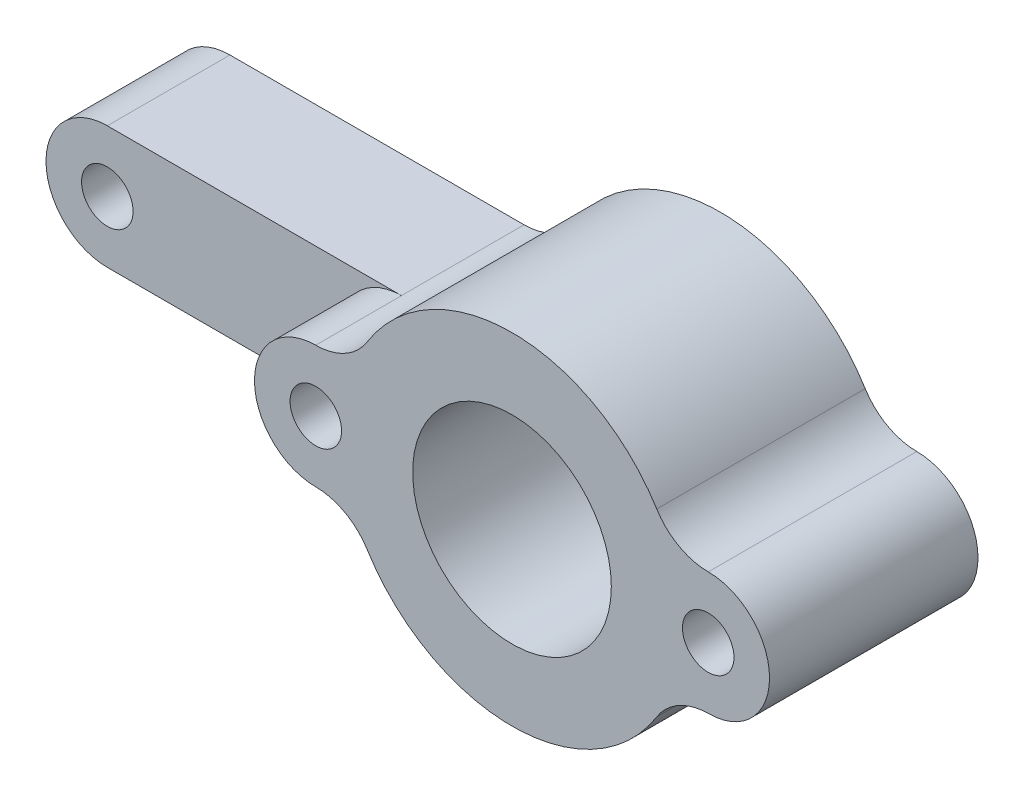
ISO-10303-21;
HEADER;
FILE_DESCRIPTION(('STEP AP214'),'2;1');
FILE_NAME('part.step','',(''),(''),'','','');
FILE_SCHEMA(('AUTOMOTIVE_DESIGN { 1 0 10303 214 1 1 1 1 }'));
ENDSEC;
DATA;
#1=APPLICATION_CONTEXT('core data for automotive mechanical design processes');
#2=APPLICATION_PROTOCOL_DEFINITION('international standard','automotive_design',2000,#1);
#3=PRODUCT_CONTEXT('',#1,'mechanical');
#4=PRODUCT('Part','Part','',(#3));
#5=PRODUCT_RELATED_PRODUCT_CATEGORY('part','',(#4));
#6=PRODUCT_DEFINITION_FORMATION('','',#4);
#7=PRODUCT_DEFINITION_CONTEXT('part definition',#1,'design');
#8=PRODUCT_DEFINITION('design','',#6,#7);
#9=PRODUCT_DEFINITION_SHAPE('','',#8);
#10=(LENGTH_UNIT() NAMED_UNIT(*) SI_UNIT(.MILLI.,.METRE.));
#11=(NAMED_UNIT(*) PLANE_ANGLE_UNIT() SI_UNIT($,.RADIAN.));
#12=(NAMED_UNIT(*) SI_UNIT($,.STERADIAN.) SOLID_ANGLE_UNIT());
#13=UNCERTAINTY_MEASURE_WITH_UNIT(LENGTH_MEASURE(1.E-05),#10,'distance_accuracy_value','');
#14=(GEOMETRIC_REPRESENTATION_CONTEXT(3) GLOBAL_UNCERTAINTY_ASSIGNED_CONTEXT((#13)) GLOBAL_UNIT_ASSIGNED_CONTEXT((#10,
#11,#12)) REPRESENTATION_CONTEXT('',''));
#15=CARTESIAN_POINT('',(0.,0.,0.));
#16=DIRECTION('',(0.,0.,1.));
#17=DIRECTION('',(1.,0.,0.));
#18=AXIS2_PLACEMENT_3D('',#15,#16,#17);
#19=CARTESIAN_POINT('',(-20.,0.,5.));
#20=DIRECTION('',(0.,0.,1.));
#21=DIRECTION('',(1.,0.,0.));
#22=AXIS2_PLACEMENT_3D('',#19,#20,#21);
#23=PLANE('',#22);
#24=CARTESIAN_POINT('',(-20.,0.,5.));
#25=DIRECTION('',(0.,0.,1.));
#26=DIRECTION('',(1.,0.,0.));
#27=AXIS2_PLACEMENT_3D('',#24,#25,#26);
#28=CIRCLE('',#27,1.05);
#29=CARTESIAN_POINT('',(-18.95,0.,5.));
#30=VERTEX_POINT('',#29);
#31=EDGE_CURVE('E295',#30,#30,#28,.T.);
#32=ORIENTED_EDGE('',*,*,#31,.F.);
#33=EDGE_LOOP('',(#32));
#34=FACE_BOUND('',#33,.T.);
#35=DIRECTION('',(1.,0.,0.));
#36=VECTOR('',#35,1.);
#37=CARTESIAN_POINT('',(-20.,-2.5,5.));
#38=LINE('',#37,#36);
#39=CARTESIAN_POINT('',(-20.,-2.5,5.));
#40=VERTEX_POINT('',#39);
#41=CARTESIAN_POINT('',(-8.01888369289576,-2.49996434112291,5.));
#42=VERTEX_POINT('',#41);
#43=EDGE_CURVE('E266',#40,#42,#38,.T.);
#44=ORIENTED_EDGE('',*,*,#43,.T.);
#45=CARTESIAN_POINT('',(-8.,0.,5.));
#46=DIRECTION('',(0.,0.,1.));
#47=DIRECTION('',(1.,0.,0.));
#48=AXIS2_PLACEMENT_3D('',#45,#46,#47);
#49=CIRCLE('',#48,2.5);
#50=CARTESIAN_POINT('',(-8.00390434736488,2.49999695121247,5.));
#51=VERTEX_POINT('',#50);
#52=EDGE_CURVE('E258',#42,#51,#49,.F.);
#53=ORIENTED_EDGE('',*,*,#52,.T.);
#54=CARTESIAN_POINT('',(-8.00777746943557,4.98,5.));
#55=DIRECTION('',(0.,0.,1.));
#56=DIRECTION('',(1.,0.,0.));
#57=AXIS2_PLACEMENT_3D('',#54,#55,#56);
#58=CIRCLE('',#57,2.48);
#59=CARTESIAN_POINT('',(-8.00777746943557,2.5,5.));
#60=VERTEX_POINT('',#59);
#61=EDGE_CURVE('E11',#51,#60,#58,.F.);
#62=ORIENTED_EDGE('',*,*,#61,.T.);
#63=DIRECTION('',(-1.,0.,0.));
#64=VECTOR('',#63,1.);
#65=CARTESIAN_POINT('',(-8.,2.5,5.));
#66=LINE('',#65,#64);
#67=CARTESIAN_POINT('',(-20.,2.5,5.));
#68=VERTEX_POINT('',#67);
#69=EDGE_CURVE('E256',#60,#68,#66,.T.);
#70=ORIENTED_EDGE('',*,*,#69,.T.);
#71=CARTESIAN_POINT('',(-20.,0.,5.));
#72=DIRECTION('',(0.,0.,1.));
#73=DIRECTION('',(1.,0.,0.));
#74=AXIS2_PLACEMENT_3D('',#71,#72,#73);
#75=CIRCLE('',#74,2.5);
#76=EDGE_CURVE('E264',#68,#40,#75,.T.);
#77=ORIENTED_EDGE('',*,*,#76,.T.);
#78=EDGE_LOOP('',(#44,#53,#62,#70,#77));
#79=FACE_BOUND('',#78,.T.);
#80=ADVANCED_FACE('F43',(#34,#79),#23,.T.);
#81=CARTESIAN_POINT('',(-20.,0.,0.));
#82=DIRECTION('',(0.,0.,1.));
#83=DIRECTION('',(1.,0.,0.));
#84=AXIS2_PLACEMENT_3D('',#81,#82,#83);
#85=PLANE('',#84);
#86=CARTESIAN_POINT('',(8.,0.,0.));
#87=DIRECTION('',(0.,0.,1.));
#88=DIRECTION('',(1.,0.,0.));
#89=AXIS2_PLACEMENT_3D('',#86,#87,#88);
#90=CIRCLE('',#89,2.05);
#91=CARTESIAN_POINT('',(10.05,0.,0.));
#92=VERTEX_POINT('',#91);
#93=EDGE_CURVE('E362',#92,#92,#90,.T.);
#94=ORIENTED_EDGE('',*,*,#93,.T.);
#95=EDGE_LOOP('',(#94));
#96=FACE_BOUND('',#95,.T.);
#97=CARTESIAN_POINT('',(-8.,0.,0.));
#98=DIRECTION('',(0.,0.,1.));
#99=DIRECTION('',(1.,0.,0.));
#100=AXIS2_PLACEMENT_3D('',#97,#98,#99);
#101=CIRCLE('',#100,2.05);
#102=CARTESIAN_POINT('',(-5.95,0.,0.));
#103=VERTEX_POINT('',#102);
#104=EDGE_CURVE('E363',#103,#103,#101,.T.);
#105=ORIENTED_EDGE('',*,*,#104,.T.);
#106=EDGE_LOOP('',(#105));
#107=FACE_BOUND('',#106,.T.);
#108=CARTESIAN_POINT('',(-20.,0.,0.));
#109=DIRECTION('',(0.,0.,1.));
#110=DIRECTION('',(1.,0.,0.));
#111=AXIS2_PLACEMENT_3D('',#108,#109,#110);
#112=CIRCLE('',#111,2.5);
#113=CARTESIAN_POINT('',(-20.,2.5,0.));
#114=VERTEX_POINT('',#113);
#115=CARTESIAN_POINT('',(-20.,-2.5,0.));
#116=VERTEX_POINT('',#115);
#117=EDGE_CURVE('E275',#114,#116,#112,.T.);
#118=ORIENTED_EDGE('',*,*,#117,.F.);
#119=DIRECTION('',(-1.,0.,0.));
#120=VECTOR('',#119,1.);
#121=CARTESIAN_POINT('',(-8.,2.5,0.));
#122=LINE('',#121,#120);
#123=CARTESIAN_POINT('',(-8.00777746943557,2.5,0.));
#124=VERTEX_POINT('',#123);
#125=EDGE_CURVE('E242',#124,#114,#122,.T.);
#126=ORIENTED_EDGE('',*,*,#125,.F.);
#127=CARTESIAN_POINT('',(-8.00777746943557,4.98,0.));
#128=DIRECTION('',(0.,0.,1.));
#129=DIRECTION('',(1.,0.,0.));
#130=AXIS2_PLACEMENT_3D('',#127,#128,#129);
#131=CIRCLE('',#130,2.48);
#132=CARTESIAN_POINT('',(-5.90180842127012,3.67030752916225,0.));
#133=VERTEX_POINT('',#132);
#134=EDGE_CURVE('E233',#124,#133,#131,.T.);
#135=ORIENTED_EDGE('',*,*,#134,.T.);
#136=CARTESIAN_POINT('',(0.,0.,0.));
#137=DIRECTION('',(0.,0.,1.));
#138=DIRECTION('',(1.,0.,0.));
#139=AXIS2_PLACEMENT_3D('',#136,#137,#138);
#140=CIRCLE('',#139,6.95);
#141=CARTESIAN_POINT('',(5.90181120758219,3.67030304880364,0.));
#142=VERTEX_POINT('',#141);
#143=EDGE_CURVE('E241',#142,#133,#140,.T.);
#144=ORIENTED_EDGE('',*,*,#143,.F.);
#145=CARTESIAN_POINT('',(8.00778125,4.97999392089473,0.));
#146=DIRECTION('',(0.,0.,1.));
#147=DIRECTION('',(1.,0.,0.));
#148=AXIS2_PLACEMENT_3D('',#145,#146,#147);
#149=CIRCLE('',#148,2.48);
#150=CARTESIAN_POINT('',(8.00390625,2.49999694824033,0.));
#151=VERTEX_POINT('',#150);
#152=EDGE_CURVE('E229',#142,#151,#149,.T.);
#153=ORIENTED_EDGE('',*,*,#152,.T.);
#154=CARTESIAN_POINT('',(8.,0.,0.));
#155=DIRECTION('',(0.,0.,1.));
#156=DIRECTION('',(1.,0.,0.));
#157=AXIS2_PLACEMENT_3D('',#154,#155,#156);
#158=CIRCLE('',#157,2.5);
#159=CARTESIAN_POINT('',(8.009453125,-2.49998212762166,0.));
#160=VERTEX_POINT('',#159);
#161=EDGE_CURVE('E250',#160,#151,#158,.T.);
#162=ORIENTED_EDGE('',*,*,#161,.F.);
#163=CARTESIAN_POINT('',(8.01890625,-4.99996425524333,0.));
#164=DIRECTION('',(0.,0.,1.));
#165=DIRECTION('',(1.,0.,0.));
#166=AXIS2_PLACEMENT_3D('',#163,#164,#165);
#167=CIRCLE('',#166,2.5);
#168=CARTESIAN_POINT('',(5.89750248015873,-3.67722238877684,0.));
#169=VERTEX_POINT('',#168);
#170=EDGE_CURVE('E156',#160,#169,#167,.T.);
#171=ORIENTED_EDGE('',*,*,#170,.T.);
#172=CARTESIAN_POINT('',(0.,0.,0.));
#173=DIRECTION('',(0.,0.,1.));
#174=DIRECTION('',(1.,0.,0.));
#175=AXIS2_PLACEMENT_3D('',#172,#173,#174);
#176=CIRCLE('',#175,6.95);
#177=CARTESIAN_POINT('',(-5.8974860886375,-3.67724867724868,0.));
#178=VERTEX_POINT('',#177);
#179=EDGE_CURVE('E376',#178,#169,#176,.T.);
#180=ORIENTED_EDGE('',*,*,#179,.F.);
#181=CARTESIAN_POINT('',(-8.01888396224811,-5.,0.));
#182=DIRECTION('',(0.,0.,1.));
#183=DIRECTION('',(1.,0.,0.));
#184=AXIS2_PLACEMENT_3D('',#181,#182,#183);
#185=CIRCLE('',#184,2.5);
#186=CARTESIAN_POINT('',(-8.01888396224811,-2.5,0.));
#187=VERTEX_POINT('',#186);
#188=EDGE_CURVE('E157',#178,#187,#185,.T.);
#189=ORIENTED_EDGE('',*,*,#188,.T.);
#190=DIRECTION('',(1.,0.,0.));
#191=VECTOR('',#190,1.);
#192=CARTESIAN_POINT('',(-8.,-2.5,0.));
#193=LINE('',#192,#191);
#194=EDGE_CURVE('E300',#116,#187,#193,.T.);
#195=ORIENTED_EDGE('',*,*,#194,.F.);
#196=EDGE_LOOP('',(#118,#126,#135,#144,#153,#162,#171,#180,#189,#195));
#197=FACE_BOUND('',#196,.T.);
#198=CARTESIAN_POINT('',(-20.,0.,0.));
#199=DIRECTION('',(0.,0.,1.));
#200=DIRECTION('',(1.,0.,0.));
#201=AXIS2_PLACEMENT_3D('',#198,#199,#200);
#202=CIRCLE('',#201,1.05);
#203=CARTESIAN_POINT('',(-18.95,0.,0.));
#204=VERTEX_POINT('',#203);
#205=EDGE_CURVE('E270',#204,#204,#202,.T.);
#206=ORIENTED_EDGE('',*,*,#205,.T.);
#207=EDGE_LOOP('',(#206));
#208=FACE_BOUND('',#207,.T.);
#209=CARTESIAN_POINT('',(0.,0.,0.));
#210=DIRECTION('',(0.,0.,1.));
#211=DIRECTION('',(1.,0.,0.));
#212=AXIS2_PLACEMENT_3D('',#209,#210,#211);
#213=CIRCLE('',#212,4.05);
#214=CARTESIAN_POINT('',(4.05,0.,0.));
#215=VERTEX_POINT('',#214);
#216=EDGE_CURVE('E140',#215,#215,#213,.T.);
#217=ORIENTED_EDGE('',*,*,#216,.T.);
#218=EDGE_LOOP('',(#217));
#219=FACE_BOUND('',#218,.T.);
#220=ADVANCED_FACE('F239',(#96,#107,#197,#208,#219),#85,.F.);
#221=CARTESIAN_POINT('',(-20.,0.,5.));
#222=DIRECTION('',(0.,0.,-1.));
#223=DIRECTION('',(-1.,0.,0.));
#224=AXIS2_PLACEMENT_3D('',#221,#222,#223);
#225=CYLINDRICAL_SURFACE('',#224,2.5);
#226=ORIENTED_EDGE('',*,*,#117,.T.);
#227=DIRECTION('',(0.,0.,-1.));
#228=VECTOR('',#227,1.);
#229=CARTESIAN_POINT('',(-20.,-2.5,5.));
#230=LINE('',#229,#228);
#231=EDGE_CURVE('E279',#40,#116,#230,.T.);
#232=ORIENTED_EDGE('',*,*,#231,.F.);
#233=ORIENTED_EDGE('',*,*,#76,.F.);
#234=DIRECTION('',(0.,0.,-1.));
#235=VECTOR('',#234,1.);
#236=CARTESIAN_POINT('',(-20.,2.5,5.));
#237=LINE('',#236,#235);
#238=EDGE_CURVE('E263',#68,#114,#237,.T.);
#239=ORIENTED_EDGE('',*,*,#238,.T.);
#240=EDGE_LOOP('',(#226,#232,#233,#239));
#241=FACE_BOUND('',#240,.T.);
#242=ADVANCED_FACE('F322',(#241),#225,.T.);
#243=CARTESIAN_POINT('',(-8.,-2.5,5.));
#244=DIRECTION('',(0.,1.,0.));
#245=DIRECTION('',(0.,0.,1.));
#246=AXIS2_PLACEMENT_3D('',#243,#244,#245);
#247=PLANE('',#246);
#248=ORIENTED_EDGE('',*,*,#194,.T.);
#249=DIRECTION('',(0.,0.,1.));
#250=VECTOR('',#249,1.);
#251=CARTESIAN_POINT('',(-8.01888396224811,-2.5,8.5));
#252=LINE('',#251,#250);
#253=EDGE_CURVE('E282',#187,#42,#252,.T.);
#254=ORIENTED_EDGE('',*,*,#253,.T.);
#255=ORIENTED_EDGE('',*,*,#43,.F.);
#256=ORIENTED_EDGE('',*,*,#231,.T.);
#257=EDGE_LOOP('',(#248,#254,#255,#256));
#258=FACE_BOUND('',#257,.T.);
#259=ADVANCED_FACE('F338',(#258),#247,.F.);
#260=CARTESIAN_POINT('',(0.,0.,5.));
#261=DIRECTION('',(0.,0.,-1.));
#262=DIRECTION('',(-1.,0.,0.));
#263=AXIS2_PLACEMENT_3D('',#260,#261,#262);
#264=CYLINDRICAL_SURFACE('',#263,6.95);
#265=CARTESIAN_POINT('',(0.,0.,8.5));
#266=DIRECTION('',(0.,0.,1.));
#267=DIRECTION('',(1.,0.,0.));
#268=AXIS2_PLACEMENT_3D('',#265,#266,#267);
#269=CIRCLE('',#268,6.95);
#270=CARTESIAN_POINT('',(-5.8974860886375,-3.67724867724868,8.5));
#271=VERTEX_POINT('',#270);
#272=CARTESIAN_POINT('',(5.89750248015873,-3.67722238877684,8.5));
#273=VERTEX_POINT('',#272);
#274=EDGE_CURVE('E377',#271,#273,#269,.T.);
#275=ORIENTED_EDGE('',*,*,#274,.F.);
#276=DIRECTION('',(0.,0.,-1.));
#277=VECTOR('',#276,1.);
#278=CARTESIAN_POINT('',(-5.8974860886375,-3.67724867724868,5.));
#279=LINE('',#278,#277);
#280=EDGE_CURVE('E155',#271,#178,#279,.T.);
#281=ORIENTED_EDGE('',*,*,#280,.T.);
#282=ORIENTED_EDGE('',*,*,#179,.T.);
#283=DIRECTION('',(0.,0.,-1.));
#284=VECTOR('',#283,1.);
#285=CARTESIAN_POINT('',(5.89750248015873,-3.67722238877684,5.));
#286=LINE('',#285,#284);
#287=EDGE_CURVE('E372',#169,#273,#286,.F.);
#288=ORIENTED_EDGE('',*,*,#287,.T.);
#289=EDGE_LOOP('',(#275,#281,#282,#288));
#290=FACE_BOUND('',#289,.T.);
#291=ADVANCED_FACE('F334',(#290),#264,.T.);
#292=CARTESIAN_POINT('',(8.,0.,5.));
#293=DIRECTION('',(0.,0.,-1.));
#294=DIRECTION('',(-1.,0.,0.));
#295=AXIS2_PLACEMENT_3D('',#292,#293,#294);
#296=CYLINDRICAL_SURFACE('',#295,2.5);
#297=ORIENTED_EDGE('',*,*,#161,.T.);
#298=DIRECTION('',(0.,0.,-1.));
#299=VECTOR('',#298,1.);
#300=CARTESIAN_POINT('',(8.00390625,2.49999694824033,5.));
#301=LINE('',#300,#299);
#302=CARTESIAN_POINT('',(8.00390625,2.49999694824033,8.5));
#303=VERTEX_POINT('',#302);
#304=EDGE_CURVE('E223',#151,#303,#301,.F.);
#305=ORIENTED_EDGE('',*,*,#304,.T.);
#306=CARTESIAN_POINT('',(8.,0.,8.5));
#307=DIRECTION('',(0.,0.,1.));
#308=DIRECTION('',(1.,0.,0.));
#309=AXIS2_PLACEMENT_3D('',#306,#307,#308);
#310=CIRCLE('',#309,2.5);
#311=CARTESIAN_POINT('',(8.009453125,-2.49998212762166,8.5));
#312=VERTEX_POINT('',#311);
#313=EDGE_CURVE('E388',#312,#303,#310,.T.);
#314=ORIENTED_EDGE('',*,*,#313,.F.);
#315=DIRECTION('',(0.,0.,-1.));
#316=VECTOR('',#315,1.);
#317=CARTESIAN_POINT('',(8.009453125,-2.49998212762166,5.));
#318=LINE('',#317,#316);
#319=EDGE_CURVE('E161',#312,#160,#318,.T.);
#320=ORIENTED_EDGE('',*,*,#319,.T.);
#321=EDGE_LOOP('',(#297,#305,#314,#320));
#322=FACE_BOUND('',#321,.T.);
#323=ADVANCED_FACE('F331',(#322),#296,.T.);
#324=CARTESIAN_POINT('',(0.,0.,5.));
#325=DIRECTION('',(0.,0.,-1.));
#326=DIRECTION('',(-1.,0.,0.));
#327=AXIS2_PLACEMENT_3D('',#324,#325,#326);
#328=CYLINDRICAL_SURFACE('',#327,6.95);
#329=CARTESIAN_POINT('',(0.,0.,8.5));
#330=DIRECTION('',(0.,0.,1.));
#331=DIRECTION('',(1.,0.,0.));
#332=AXIS2_PLACEMENT_3D('',#329,#330,#331);
#333=CIRCLE('',#332,6.95);
#334=CARTESIAN_POINT('',(5.90181120758219,3.67030304880364,8.5));
#335=VERTEX_POINT('',#334);
#336=CARTESIAN_POINT('',(-5.90180842127012,3.67030752916225,8.5));
#337=VERTEX_POINT('',#336);
#338=EDGE_CURVE('E150',#335,#337,#333,.T.);
#339=ORIENTED_EDGE('',*,*,#338,.F.);
#340=DIRECTION('',(0.,0.,-1.));
#341=VECTOR('',#340,1.);
#342=CARTESIAN_POINT('',(5.90181120758219,3.67030304880364,5.));
#343=LINE('',#342,#341);
#344=EDGE_CURVE('E220',#335,#142,#343,.T.);
#345=ORIENTED_EDGE('',*,*,#344,.T.);
#346=ORIENTED_EDGE('',*,*,#143,.T.);
#347=DIRECTION('',(0.,0.,-1.));
#348=VECTOR('',#347,1.);
#349=CARTESIAN_POINT('',(-5.90180842127012,3.67030752916225,5.));
#350=LINE('',#349,#348);
#351=EDGE_CURVE('E213',#133,#337,#350,.F.);
#352=ORIENTED_EDGE('',*,*,#351,.T.);
#353=EDGE_LOOP('',(#339,#345,#346,#352));
#354=FACE_BOUND('',#353,.T.);
#355=ADVANCED_FACE('F248',(#354),#328,.T.);
#356=CARTESIAN_POINT('',(-8.,2.5,5.));
#357=DIRECTION('',(0.,-1.,0.));
#358=DIRECTION('',(0.,0.,-1.));
#359=AXIS2_PLACEMENT_3D('',#356,#357,#358);
#360=PLANE('',#359);
#361=ORIENTED_EDGE('',*,*,#69,.F.);
#362=DIRECTION('',(0.,0.,1.));
#363=VECTOR('',#362,1.);
#364=CARTESIAN_POINT('',(-8.00777746943557,2.5,0.));
#365=LINE('',#364,#363);
#366=EDGE_CURVE('E225',#60,#124,#365,.F.);
#367=ORIENTED_EDGE('',*,*,#366,.T.);
#368=ORIENTED_EDGE('',*,*,#125,.T.);
#369=ORIENTED_EDGE('',*,*,#238,.F.);
#370=EDGE_LOOP('',(#361,#367,#368,#369));
#371=FACE_BOUND('',#370,.T.);
#372=ADVANCED_FACE('F261',(#371),#360,.F.);
#373=CARTESIAN_POINT('',(-8.,0.,5.));
#374=DIRECTION('',(0.,0.,-1.));
#375=DIRECTION('',(-1.,0.,0.));
#376=AXIS2_PLACEMENT_3D('',#373,#374,#375);
#377=CYLINDRICAL_SURFACE('',#376,1.05);
#378=CARTESIAN_POINT('',(-8.,0.,1.));
#379=DIRECTION('',(0.,0.,1.));
#380=DIRECTION('',(1.,0.,0.));
#381=AXIS2_PLACEMENT_3D('',#378,#379,#380);
#382=CIRCLE('',#381,1.05);
#383=CARTESIAN_POINT('',(-6.95,0.,1.));
#384=VERTEX_POINT('',#383);
#385=EDGE_CURVE('E365',#384,#384,#382,.F.);
#386=ORIENTED_EDGE('',*,*,#385,.T.);
#387=EDGE_LOOP('',(#386));
#388=FACE_BOUND('',#387,.T.);
#389=CARTESIAN_POINT('',(-8.,0.,8.5));
#390=DIRECTION('',(0.,0.,1.));
#391=DIRECTION('',(1.,0.,0.));
#392=AXIS2_PLACEMENT_3D('',#389,#390,#391);
#393=CIRCLE('',#392,1.05);
#394=CARTESIAN_POINT('',(-6.95,0.,8.5));
#395=VERTEX_POINT('',#394);
#396=EDGE_CURVE('E396',#395,#395,#393,.F.);
#397=ORIENTED_EDGE('',*,*,#396,.F.);
#398=EDGE_LOOP('',(#397));
#399=FACE_BOUND('',#398,.T.);
#400=ADVANCED_FACE('F313',(#388,#399),#377,.F.);
#401=CARTESIAN_POINT('',(8.,0.,5.));
#402=DIRECTION('',(0.,0.,-1.));
#403=DIRECTION('',(-1.,0.,0.));
#404=AXIS2_PLACEMENT_3D('',#401,#402,#403);
#405=CYLINDRICAL_SURFACE('',#404,1.05);
#406=CARTESIAN_POINT('',(8.,0.,1.));
#407=DIRECTION('',(0.,0.,1.));
#408=DIRECTION('',(1.,0.,0.));
#409=AXIS2_PLACEMENT_3D('',#406,#407,#408);
#410=CIRCLE('',#409,1.05);
#411=CARTESIAN_POINT('',(9.05,0.,1.));
#412=VERTEX_POINT('',#411);
#413=EDGE_CURVE('E359',#412,#412,#410,.F.);
#414=ORIENTED_EDGE('',*,*,#413,.T.);
#415=EDGE_LOOP('',(#414));
#416=FACE_BOUND('',#415,.T.);
#417=CARTESIAN_POINT('',(8.,0.,8.5));
#418=DIRECTION('',(0.,0.,1.));
#419=DIRECTION('',(1.,0.,0.));
#420=AXIS2_PLACEMENT_3D('',#417,#418,#419);
#421=CIRCLE('',#420,1.05);
#422=CARTESIAN_POINT('',(9.05,0.,8.5));
#423=VERTEX_POINT('',#422);
#424=EDGE_CURVE('E141',#423,#423,#421,.F.);
#425=ORIENTED_EDGE('',*,*,#424,.F.);
#426=EDGE_LOOP('',(#425));
#427=FACE_BOUND('',#426,.T.);
#428=ADVANCED_FACE('F307',(#416,#427),#405,.F.);
#429=CARTESIAN_POINT('',(-20.,0.,5.));
#430=DIRECTION('',(0.,0.,-1.));
#431=DIRECTION('',(-1.,0.,0.));
#432=AXIS2_PLACEMENT_3D('',#429,#430,#431);
#433=CYLINDRICAL_SURFACE('',#432,1.05);
#434=ORIENTED_EDGE('',*,*,#31,.T.);
#435=EDGE_LOOP('',(#434));
#436=FACE_BOUND('',#435,.T.);
#437=ORIENTED_EDGE('',*,*,#205,.F.);
#438=EDGE_LOOP('',(#437));
#439=FACE_BOUND('',#438,.T.);
#440=ADVANCED_FACE('F305',(#436,#439),#433,.F.);
#441=CARTESIAN_POINT('',(0.,0.,5.));
#442=DIRECTION('',(0.,0.,-1.));
#443=DIRECTION('',(-1.,0.,0.));
#444=AXIS2_PLACEMENT_3D('',#441,#442,#443);
#445=CYLINDRICAL_SURFACE('',#444,4.05);
#446=ORIENTED_EDGE('',*,*,#216,.F.);
#447=EDGE_LOOP('',(#446));
#448=FACE_BOUND('',#447,.T.);
#449=CARTESIAN_POINT('',(0.,0.,8.5));
#450=DIRECTION('',(0.,0.,1.));
#451=DIRECTION('',(1.,0.,0.));
#452=AXIS2_PLACEMENT_3D('',#449,#450,#451);
#453=CIRCLE('',#452,4.05);
#454=CARTESIAN_POINT('',(4.05,0.,8.5));
#455=VERTEX_POINT('',#454);
#456=EDGE_CURVE('E149',#455,#455,#453,.F.);
#457=ORIENTED_EDGE('',*,*,#456,.F.);
#458=EDGE_LOOP('',(#457));
#459=FACE_BOUND('',#458,.T.);
#460=ADVANCED_FACE('F207',(#448,#459),#445,.F.);
#461=CARTESIAN_POINT('',(-8.,0.,8.5));
#462=DIRECTION('',(0.,0.,-1.));
#463=DIRECTION('',(-1.,0.,0.));
#464=AXIS2_PLACEMENT_3D('',#461,#462,#463);
#465=CYLINDRICAL_SURFACE('',#464,2.5);
#466=CARTESIAN_POINT('',(-8.,0.,8.5));
#467=DIRECTION('',(0.,0.,1.));
#468=DIRECTION('',(1.,0.,0.));
#469=AXIS2_PLACEMENT_3D('',#466,#467,#468);
#470=CIRCLE('',#469,2.5);
#471=CARTESIAN_POINT('',(-8.00000051982128,-2.50006881782551,8.5));
#472=VERTEX_POINT('',#471);
#473=CARTESIAN_POINT('',(-8.00390434736488,2.49999695121247,8.5));
#474=VERTEX_POINT('',#473);
#475=EDGE_CURVE('E133',#472,#474,#470,.F.);
#476=ORIENTED_EDGE('',*,*,#475,.T.);
#477=DIRECTION('',(0.,0.,-1.));
#478=VECTOR('',#477,1.);
#479=CARTESIAN_POINT('',(-8.00390434736488,2.49999695121247,6.75));
#480=LINE('',#479,#478);
#481=EDGE_CURVE('E58',#474,#51,#480,.T.);
#482=ORIENTED_EDGE('',*,*,#481,.T.);
#483=ORIENTED_EDGE('',*,*,#52,.F.);
#484=CARTESIAN_POINT('',(-8.01888396224811,-5.,5.));
#485=DIRECTION('',(0.,0.,1.));
#486=DIRECTION('',(0.0075533694173624,0.999971472898325,0.));
#487=AXIS2_PLACEMENT_3D('',#484,#485,#486);
#488=CIRCLE('',#487,2.5);
#489=CARTESIAN_POINT('',(-8.,-2.5,5.));
#490=VERTEX_POINT('',#489);
#491=EDGE_CURVE('E135',#490,#42,#488,.T.);
#492=ORIENTED_EDGE('',*,*,#491,.F.);
#493=CARTESIAN_POINT('',(-8.00000053870471,-2.50007131775419,8.5));
#494=DIRECTION('',(0.,0.,-1.));
#495=VECTOR('',#494,1.);
#496=LINE('',#493,#495);
#497=EDGE_CURVE('E130',#472,#490,#496,.T.);
#498=ORIENTED_EDGE('',*,*,#497,.F.);
#499=EDGE_LOOP('',(#476,#482,#483,#492,#498));
#500=FACE_BOUND('',#499,.T.);
#501=ADVANCED_FACE('F132',(#500),#465,.T.);
#502=CARTESIAN_POINT('',(0.,0.,8.5));
#503=DIRECTION('',(0.,0.,1.));
#504=DIRECTION('',(1.,0.,0.));
#505=AXIS2_PLACEMENT_3D('',#502,#503,#504);
#506=PLANE('',#505);
#507=ORIENTED_EDGE('',*,*,#475,.F.);
#508=CARTESIAN_POINT('',(-8.01888396224811,-5.,8.5));
#509=DIRECTION('',(0.,0.,1.));
#510=DIRECTION('',(1.,0.,0.));
#511=AXIS2_PLACEMENT_3D('',#508,#509,#510);
#512=CIRCLE('',#511,2.5);
#513=EDGE_CURVE('E147',#472,#271,#512,.F.);
#514=ORIENTED_EDGE('',*,*,#513,.T.);
#515=ORIENTED_EDGE('',*,*,#274,.T.);
#516=CARTESIAN_POINT('',(8.01890625,-4.99996425524333,8.5));
#517=DIRECTION('',(0.,0.,1.));
#518=DIRECTION('',(1.,0.,0.));
#519=AXIS2_PLACEMENT_3D('',#516,#517,#518);
#520=CIRCLE('',#519,2.5);
#521=EDGE_CURVE('E159',#273,#312,#520,.F.);
#522=ORIENTED_EDGE('',*,*,#521,.T.);
#523=ORIENTED_EDGE('',*,*,#313,.T.);
#524=CARTESIAN_POINT('',(8.00778125,4.97999392089473,8.5));
#525=DIRECTION('',(0.,0.,1.));
#526=DIRECTION('',(1.,0.,0.));
#527=AXIS2_PLACEMENT_3D('',#524,#525,#526);
#528=CIRCLE('',#527,2.48);
#529=EDGE_CURVE('E231',#303,#335,#528,.F.);
#530=ORIENTED_EDGE('',*,*,#529,.T.);
#531=ORIENTED_EDGE('',*,*,#338,.T.);
#532=CARTESIAN_POINT('',(-8.00777746943557,4.98,8.5));
#533=DIRECTION('',(0.,0.,1.));
#534=DIRECTION('',(1.,0.,0.));
#535=AXIS2_PLACEMENT_3D('',#532,#533,#534);
#536=CIRCLE('',#535,2.48);
#537=EDGE_CURVE('E51',#337,#474,#536,.F.);
#538=ORIENTED_EDGE('',*,*,#537,.T.);
#539=EDGE_LOOP('',(#507,#514,#515,#522,#523,#530,#531,#538));
#540=FACE_BOUND('',#539,.T.);
#541=ORIENTED_EDGE('',*,*,#456,.T.);
#542=EDGE_LOOP('',(#541));
#543=FACE_BOUND('',#542,.T.);
#544=ORIENTED_EDGE('',*,*,#396,.T.);
#545=EDGE_LOOP('',(#544));
#546=FACE_BOUND('',#545,.T.);
#547=ORIENTED_EDGE('',*,*,#424,.T.);
#548=EDGE_LOOP('',(#547));
#549=FACE_BOUND('',#548,.T.);
#550=ADVANCED_FACE('F144',(#540,#543,#546,#549),#506,.T.);
#551=CARTESIAN_POINT('',(8.,0.,0.));
#552=DIRECTION('',(0.,0.,-1.));
#553=DIRECTION('',(-1.,0.,0.));
#554=AXIS2_PLACEMENT_3D('',#551,#552,#553);
#555=CONICAL_SURFACE('',#554,2.05,0.785398163397447);
#556=ORIENTED_EDGE('',*,*,#413,.F.);
#557=EDGE_LOOP('',(#556));
#558=FACE_BOUND('',#557,.T.);
#559=ORIENTED_EDGE('',*,*,#93,.F.);
#560=EDGE_LOOP('',(#559));
#561=FACE_BOUND('',#560,.T.);
#562=ADVANCED_FACE('F346',(#558,#561),#555,.F.);
#563=CARTESIAN_POINT('',(-8.,0.,0.));
#564=DIRECTION('',(0.,0.,-1.));
#565=DIRECTION('',(-1.,0.,0.));
#566=AXIS2_PLACEMENT_3D('',#563,#564,#565);
#567=CONICAL_SURFACE('',#566,2.05,0.785398163397447);
#568=ORIENTED_EDGE('',*,*,#385,.F.);
#569=EDGE_LOOP('',(#568));
#570=FACE_BOUND('',#569,.T.);
#571=ORIENTED_EDGE('',*,*,#104,.F.);
#572=EDGE_LOOP('',(#571));
#573=FACE_BOUND('',#572,.T.);
#574=ADVANCED_FACE('F184',(#570,#573),#567,.F.);
#575=CARTESIAN_POINT('',(-8.01888396224811,-5.,5.));
#576=DIRECTION('',(0.,0.,-1.));
#577=DIRECTION('',(-1.,0.,0.));
#578=AXIS2_PLACEMENT_3D('',#575,#576,#577);
#579=CYLINDRICAL_SURFACE('',#578,2.5);
#580=ORIENTED_EDGE('',*,*,#491,.T.);
#581=ORIENTED_EDGE('',*,*,#253,.F.);
#582=ORIENTED_EDGE('',*,*,#188,.F.);
#583=ORIENTED_EDGE('',*,*,#280,.F.);
#584=ORIENTED_EDGE('',*,*,#513,.F.);
#585=ORIENTED_EDGE('',*,*,#497,.T.);
#586=EDGE_LOOP('',(#580,#581,#582,#583,#584,#585));
#587=FACE_BOUND('',#586,.T.);
#588=ADVANCED_FACE('F153',(#587),#579,.F.);
#589=CARTESIAN_POINT('',(8.01890625,-4.99996425524333,5.));
#590=DIRECTION('',(0.,0.,1.));
#591=DIRECTION('',(1.,0.,0.));
#592=AXIS2_PLACEMENT_3D('',#589,#590,#591);
#593=CYLINDRICAL_SURFACE('',#592,2.5);
#594=ORIENTED_EDGE('',*,*,#521,.F.);
#595=ORIENTED_EDGE('',*,*,#287,.F.);
#596=ORIENTED_EDGE('',*,*,#170,.F.);
#597=ORIENTED_EDGE('',*,*,#319,.F.);
#598=EDGE_LOOP('',(#594,#595,#596,#597));
#599=FACE_BOUND('',#598,.T.);
#600=ADVANCED_FACE('F183',(#599),#593,.F.);
#601=CARTESIAN_POINT('',(8.00778125,4.97999392089473,5.));
#602=DIRECTION('',(0.,0.,1.));
#603=DIRECTION('',(1.,0.,0.));
#604=AXIS2_PLACEMENT_3D('',#601,#602,#603);
#605=CYLINDRICAL_SURFACE('',#604,2.48);
#606=ORIENTED_EDGE('',*,*,#529,.F.);
#607=ORIENTED_EDGE('',*,*,#304,.F.);
#608=ORIENTED_EDGE('',*,*,#152,.F.);
#609=ORIENTED_EDGE('',*,*,#344,.F.);
#610=EDGE_LOOP('',(#606,#607,#608,#609));
#611=FACE_BOUND('',#610,.T.);
#612=ADVANCED_FACE('F465',(#611),#605,.F.);
#613=CARTESIAN_POINT('',(-8.00777746943557,4.98,5.));
#614=DIRECTION('',(0.,0.,-1.));
#615=DIRECTION('',(-1.,0.,0.));
#616=AXIS2_PLACEMENT_3D('',#613,#614,#615);
#617=CYLINDRICAL_SURFACE('',#616,2.48);
#618=ORIENTED_EDGE('',*,*,#537,.F.);
#619=ORIENTED_EDGE('',*,*,#351,.F.);
#620=ORIENTED_EDGE('',*,*,#134,.F.);
#621=ORIENTED_EDGE('',*,*,#366,.F.);
#622=ORIENTED_EDGE('',*,*,#61,.F.);
#623=ORIENTED_EDGE('',*,*,#481,.F.);
#624=EDGE_LOOP('',(#618,#619,#620,#621,#622,#623));
#625=FACE_BOUND('',#624,.T.);
#626=ADVANCED_FACE('F45',(#625),#617,.F.);
#627=CLOSED_SHELL('',(#80,#220,#242,#259,#291,#323,#355,#372,#400,#428,#440,#460,#501,#550,#562,
#574,#588,#600,#612,#626));
#628=MANIFOLD_SOLID_BREP('B2',#627);
#629=ADVANCED_BREP_SHAPE_REPRESENTATION('',(#18,#628),#14);
#630=SHAPE_DEFINITION_REPRESENTATION(#9,#629);
ENDSEC;
END-ISO-10303-21;
